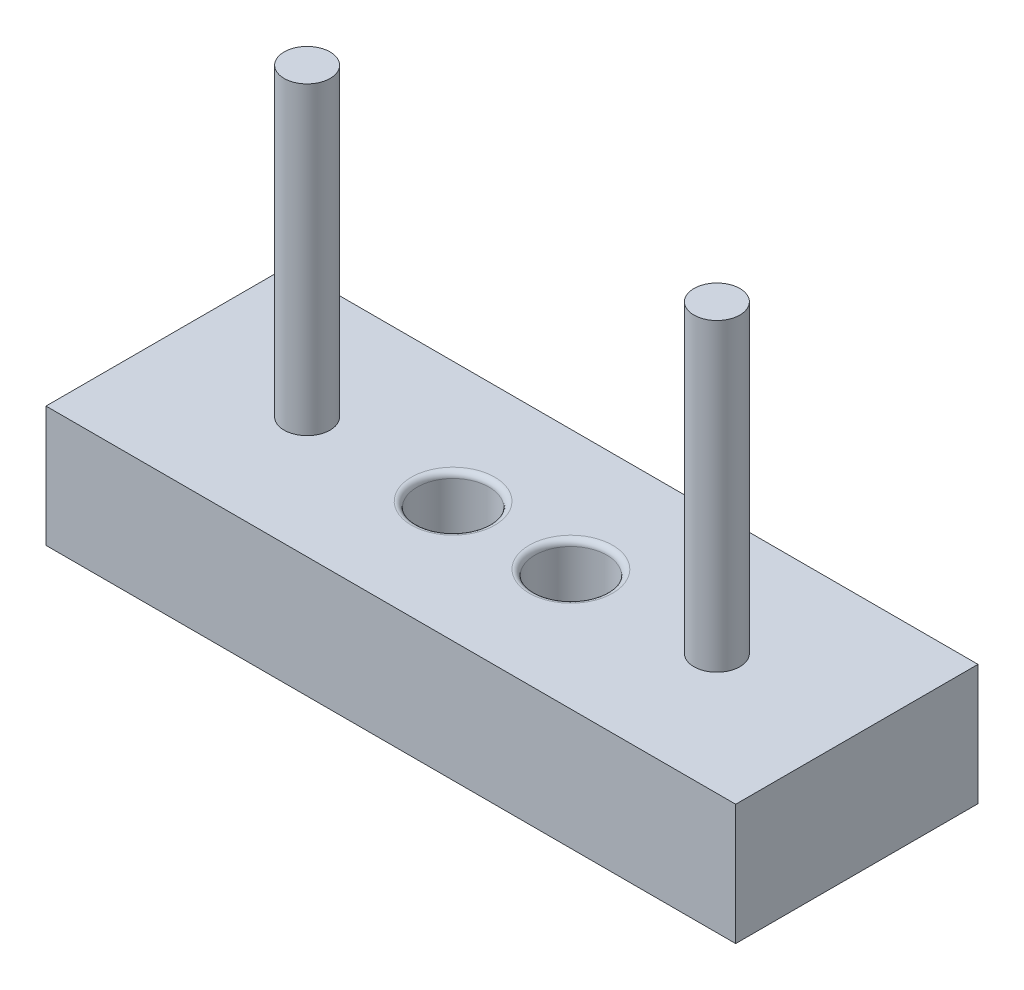
ISO-10303-21;
HEADER;
FILE_DESCRIPTION(('STEP AP214'),'2;1');
FILE_NAME('part.step','',(''),(''),'','','');
FILE_SCHEMA(('AUTOMOTIVE_DESIGN { 1 0 10303 214 1 1 1 1 }'));
ENDSEC;
DATA;
#1=APPLICATION_CONTEXT('core data for automotive mechanical design processes');
#2=APPLICATION_PROTOCOL_DEFINITION('international standard','automotive_design',2000,#1);
#3=PRODUCT_CONTEXT('',#1,'mechanical');
#4=PRODUCT('Part','Part','',(#3));
#5=PRODUCT_RELATED_PRODUCT_CATEGORY('part','',(#4));
#6=PRODUCT_DEFINITION_FORMATION('','',#4);
#7=PRODUCT_DEFINITION_CONTEXT('part definition',#1,'design');
#8=PRODUCT_DEFINITION('design','',#6,#7);
#9=PRODUCT_DEFINITION_SHAPE('','',#8);
#10=(LENGTH_UNIT() NAMED_UNIT(*) SI_UNIT(.MILLI.,.METRE.));
#11=(NAMED_UNIT(*) PLANE_ANGLE_UNIT() SI_UNIT($,.RADIAN.));
#12=(NAMED_UNIT(*) SI_UNIT($,.STERADIAN.) SOLID_ANGLE_UNIT());
#13=UNCERTAINTY_MEASURE_WITH_UNIT(LENGTH_MEASURE(1.E-05),#10,'distance_accuracy_value','');
#14=(GEOMETRIC_REPRESENTATION_CONTEXT(3) GLOBAL_UNCERTAINTY_ASSIGNED_CONTEXT((#13)) GLOBAL_UNIT_ASSIGNED_CONTEXT((#10,
#11,#12)) REPRESENTATION_CONTEXT('',''));
#15=CARTESIAN_POINT('',(0.,0.,0.));
#16=DIRECTION('',(0.,0.,1.));
#17=DIRECTION('',(1.,0.,0.));
#18=AXIS2_PLACEMENT_3D('',#15,#16,#17);
#19=CARTESIAN_POINT('',(-43.188970763014,21.,-20.565514618493));
#20=DIRECTION('',(1.,0.,0.));
#21=DIRECTION('',(0.,0.,-1.));
#22=AXIS2_PLACEMENT_3D('',#19,#20,#21);
#23=PLANE('',#22);
#24=DIRECTION('',(0.,0.,1.));
#25=VECTOR('',#24,1.);
#26=CARTESIAN_POINT('',(-43.188970763014,0.,-20.565514618493));
#27=LINE('',#26,#25);
#28=CARTESIAN_POINT('',(-43.188970763014,0.,-20.565514618493));
#29=VERTEX_POINT('',#28);
#30=CARTESIAN_POINT('',(-43.188970763014,0.,21.594485381507));
#31=VERTEX_POINT('',#30);
#32=EDGE_CURVE('E106',#29,#31,#27,.T.);
#33=ORIENTED_EDGE('',*,*,#32,.T.);
#34=DIRECTION('',(0.,-1.,0.));
#35=VECTOR('',#34,1.);
#36=CARTESIAN_POINT('',(-43.188970763014,21.,21.594485381507));
#37=LINE('',#36,#35);
#38=CARTESIAN_POINT('',(-43.188970763014,21.,21.594485381507));
#39=VERTEX_POINT('',#38);
#40=EDGE_CURVE('E97',#39,#31,#37,.T.);
#41=ORIENTED_EDGE('',*,*,#40,.F.);
#42=DIRECTION('',(0.,0.,1.));
#43=VECTOR('',#42,1.);
#44=CARTESIAN_POINT('',(-43.188970763014,21.,-20.565514618493));
#45=LINE('',#44,#43);
#46=CARTESIAN_POINT('',(-43.188970763014,21.,-20.565514618493));
#47=VERTEX_POINT('',#46);
#48=EDGE_CURVE('E91',#47,#39,#45,.T.);
#49=ORIENTED_EDGE('',*,*,#48,.F.);
#50=DIRECTION('',(0.,-1.,0.));
#51=VECTOR('',#50,1.);
#52=CARTESIAN_POINT('',(-43.188970763014,21.,-20.565514618493));
#53=LINE('',#52,#51);
#54=EDGE_CURVE('E102',#47,#29,#53,.T.);
#55=ORIENTED_EDGE('',*,*,#54,.T.);
#56=EDGE_LOOP('',(#33,#41,#49,#55));
#57=FACE_BOUND('',#56,.T.);
#58=ADVANCED_FACE('F38',(#57),#23,.F.);
#59=CARTESIAN_POINT('',(-43.188970763014,21.,21.594485381507));
#60=DIRECTION('',(0.,0.,-1.));
#61=DIRECTION('',(-1.,0.,0.));
#62=AXIS2_PLACEMENT_3D('',#59,#60,#61);
#63=PLANE('',#62);
#64=DIRECTION('',(1.,0.,0.));
#65=VECTOR('',#64,1.);
#66=CARTESIAN_POINT('',(-43.188970763014,0.,21.594485381507));
#67=LINE('',#66,#65);
#68=CARTESIAN_POINT('',(76.811029236986,0.,21.594485381507));
#69=VERTEX_POINT('',#68);
#70=EDGE_CURVE('E96',#31,#69,#67,.T.);
#71=ORIENTED_EDGE('',*,*,#70,.T.);
#72=DIRECTION('',(0.,-1.,0.));
#73=VECTOR('',#72,1.);
#74=CARTESIAN_POINT('',(76.811029236986,21.,21.594485381507));
#75=LINE('',#74,#73);
#76=CARTESIAN_POINT('',(76.811029236986,21.,21.594485381507));
#77=VERTEX_POINT('',#76);
#78=EDGE_CURVE('E94',#77,#69,#75,.T.);
#79=ORIENTED_EDGE('',*,*,#78,.F.);
#80=DIRECTION('',(1.,0.,0.));
#81=VECTOR('',#80,1.);
#82=CARTESIAN_POINT('',(-43.188970763014,21.,21.594485381507));
#83=LINE('',#82,#81);
#84=EDGE_CURVE('E86',#39,#77,#83,.T.);
#85=ORIENTED_EDGE('',*,*,#84,.F.);
#86=ORIENTED_EDGE('',*,*,#40,.T.);
#87=EDGE_LOOP('',(#71,#79,#85,#86));
#88=FACE_BOUND('',#87,.T.);
#89=ADVANCED_FACE('F95',(#88),#63,.F.);
#90=CARTESIAN_POINT('',(76.811029236986,21.,-20.565514618493));
#91=DIRECTION('',(-1.,0.,0.));
#92=DIRECTION('',(0.,0.,1.));
#93=AXIS2_PLACEMENT_3D('',#90,#91,#92);
#94=PLANE('',#93);
#95=DIRECTION('',(0.,0.,-1.));
#96=VECTOR('',#95,1.);
#97=CARTESIAN_POINT('',(76.811029236986,0.,-20.565514618493));
#98=LINE('',#97,#96);
#99=CARTESIAN_POINT('',(76.811029236986,0.,-20.565514618493));
#100=VERTEX_POINT('',#99);
#101=EDGE_CURVE('E72',#69,#100,#98,.T.);
#102=ORIENTED_EDGE('',*,*,#101,.T.);
#103=DIRECTION('',(0.,-1.,0.));
#104=VECTOR('',#103,1.);
#105=CARTESIAN_POINT('',(76.811029236986,21.,-20.565514618493));
#106=LINE('',#105,#104);
#107=CARTESIAN_POINT('',(76.811029236986,21.,-20.565514618493));
#108=VERTEX_POINT('',#107);
#109=EDGE_CURVE('E98',#108,#100,#106,.T.);
#110=ORIENTED_EDGE('',*,*,#109,.F.);
#111=DIRECTION('',(0.,0.,-1.));
#112=VECTOR('',#111,1.);
#113=CARTESIAN_POINT('',(76.811029236986,21.,-20.565514618493));
#114=LINE('',#113,#112);
#115=EDGE_CURVE('E89',#77,#108,#114,.T.);
#116=ORIENTED_EDGE('',*,*,#115,.F.);
#117=ORIENTED_EDGE('',*,*,#78,.T.);
#118=EDGE_LOOP('',(#102,#110,#116,#117));
#119=FACE_BOUND('',#118,.T.);
#120=ADVANCED_FACE('F100',(#119),#94,.F.);
#121=CARTESIAN_POINT('',(-43.188970763014,21.,-20.565514618493));
#122=DIRECTION('',(0.,0.,1.));
#123=DIRECTION('',(1.,0.,0.));
#124=AXIS2_PLACEMENT_3D('',#121,#122,#123);
#125=PLANE('',#124);
#126=DIRECTION('',(-1.,0.,0.));
#127=VECTOR('',#126,1.);
#128=CARTESIAN_POINT('',(-43.188970763014,0.,-20.565514618493));
#129=LINE('',#128,#127);
#130=EDGE_CURVE('E78',#100,#29,#129,.T.);
#131=ORIENTED_EDGE('',*,*,#130,.T.);
#132=ORIENTED_EDGE('',*,*,#54,.F.);
#133=DIRECTION('',(-1.,0.,0.));
#134=VECTOR('',#133,1.);
#135=CARTESIAN_POINT('',(-43.188970763014,21.,-20.565514618493));
#136=LINE('',#135,#134);
#137=EDGE_CURVE('E55',#108,#47,#136,.T.);
#138=ORIENTED_EDGE('',*,*,#137,.F.);
#139=ORIENTED_EDGE('',*,*,#109,.T.);
#140=EDGE_LOOP('',(#131,#132,#138,#139));
#141=FACE_BOUND('',#140,.T.);
#142=ADVANCED_FACE('F154',(#141),#125,.F.);
#143=CARTESIAN_POINT('',(0.,21.,0.));
#144=DIRECTION('',(0.,1.,0.));
#145=DIRECTION('',(0.,0.,1.));
#146=AXIS2_PLACEMENT_3D('',#143,#144,#145);
#147=PLANE('',#146);
#148=CARTESIAN_POINT('',(-18.838970763014,21.,0.514485381507019));
#149=DIRECTION('',(0.,1.,0.));
#150=DIRECTION('',(0.,0.,1.));
#151=AXIS2_PLACEMENT_3D('',#148,#149,#150);
#152=CIRCLE('',#151,4.);
#153=CARTESIAN_POINT('',(-18.838970763014,21.,4.51448538150702));
#154=VERTEX_POINT('',#153);
#155=EDGE_CURVE('E208',#154,#154,#152,.T.);
#156=ORIENTED_EDGE('',*,*,#155,.F.);
#157=EDGE_LOOP('',(#156));
#158=FACE_BOUND('',#157,.T.);
#159=CARTESIAN_POINT('',(52.461029236986,21.,0.514485381507019));
#160=DIRECTION('',(0.,1.,0.));
#161=DIRECTION('',(0.,0.,1.));
#162=AXIS2_PLACEMENT_3D('',#159,#160,#161);
#163=CIRCLE('',#162,4.00000000000001);
#164=CARTESIAN_POINT('',(52.461029236986,21.,4.51448538150702));
#165=VERTEX_POINT('',#164);
#166=EDGE_CURVE('E202',#165,#165,#163,.T.);
#167=ORIENTED_EDGE('',*,*,#166,.F.);
#168=EDGE_LOOP('',(#167));
#169=FACE_BOUND('',#168,.T.);
#170=CARTESIAN_POINT('',(6.56102923698599,21.,0.514485381507019));
#171=DIRECTION('',(0.,1.,0.));
#172=DIRECTION('',(0.,0.,1.));
#173=AXIS2_PLACEMENT_3D('',#170,#171,#172);
#174=CIRCLE('',#173,7.25);
#175=CARTESIAN_POINT('',(6.56102923698599,21.,7.76448538150702));
#176=VERTEX_POINT('',#175);
#177=EDGE_CURVE('E122',#176,#176,#174,.F.);
#178=ORIENTED_EDGE('',*,*,#177,.T.);
#179=EDGE_LOOP('',(#178));
#180=FACE_BOUND('',#179,.T.);
#181=CARTESIAN_POINT('',(27.061029236986,21.,0.514485381507019));
#182=DIRECTION('',(0.,1.,0.));
#183=DIRECTION('',(0.,0.,1.));
#184=AXIS2_PLACEMENT_3D('',#181,#182,#183);
#185=CIRCLE('',#184,7.25);
#186=CARTESIAN_POINT('',(27.061029236986,21.,7.76448538150702));
#187=VERTEX_POINT('',#186);
#188=EDGE_CURVE('E119',#187,#187,#185,.F.);
#189=ORIENTED_EDGE('',*,*,#188,.T.);
#190=EDGE_LOOP('',(#189));
#191=FACE_BOUND('',#190,.T.);
#192=ORIENTED_EDGE('',*,*,#48,.T.);
#193=ORIENTED_EDGE('',*,*,#84,.T.);
#194=ORIENTED_EDGE('',*,*,#115,.T.);
#195=ORIENTED_EDGE('',*,*,#137,.T.);
#196=EDGE_LOOP('',(#192,#193,#194,#195));
#197=FACE_BOUND('',#196,.T.);
#198=ADVANCED_FACE('F87',(#158,#169,#180,#191,#197),#147,.T.);
#199=CARTESIAN_POINT('',(0.,0.,0.));
#200=DIRECTION('',(0.,1.,0.));
#201=DIRECTION('',(0.,0.,1.));
#202=AXIS2_PLACEMENT_3D('',#199,#200,#201);
#203=PLANE('',#202);
#204=CARTESIAN_POINT('',(6.56102923698599,0.,0.514485381507019));
#205=DIRECTION('',(0.,1.,0.));
#206=DIRECTION('',(0.,0.,1.));
#207=AXIS2_PLACEMENT_3D('',#204,#205,#206);
#208=CIRCLE('',#207,3.75);
#209=CARTESIAN_POINT('',(6.56102923698599,0.,4.26448538150702));
#210=VERTEX_POINT('',#209);
#211=EDGE_CURVE('E131',#210,#210,#208,.T.);
#212=ORIENTED_EDGE('',*,*,#211,.T.);
#213=EDGE_LOOP('',(#212));
#214=FACE_BOUND('',#213,.T.);
#215=CARTESIAN_POINT('',(27.061029236986,0.,0.514485381507019));
#216=DIRECTION('',(0.,1.,0.));
#217=DIRECTION('',(0.,0.,1.));
#218=AXIS2_PLACEMENT_3D('',#215,#216,#217);
#219=CIRCLE('',#218,3.75);
#220=CARTESIAN_POINT('',(27.061029236986,0.,4.26448538150702));
#221=VERTEX_POINT('',#220);
#222=EDGE_CURVE('E128',#221,#221,#219,.T.);
#223=ORIENTED_EDGE('',*,*,#222,.T.);
#224=EDGE_LOOP('',(#223));
#225=FACE_BOUND('',#224,.T.);
#226=ORIENTED_EDGE('',*,*,#32,.F.);
#227=ORIENTED_EDGE('',*,*,#130,.F.);
#228=ORIENTED_EDGE('',*,*,#101,.F.);
#229=ORIENTED_EDGE('',*,*,#70,.F.);
#230=EDGE_LOOP('',(#226,#227,#228,#229));
#231=FACE_BOUND('',#230,.T.);
#232=ADVANCED_FACE('F145',(#214,#225,#231),#203,.F.);
#233=CARTESIAN_POINT('',(27.061029236986,7.,0.514485381507019));
#234=DIRECTION('',(0.,1.,0.));
#235=DIRECTION('',(0.,0.,1.));
#236=AXIS2_PLACEMENT_3D('',#233,#234,#235);
#237=CYLINDRICAL_SURFACE('',#236,6.25);
#238=CARTESIAN_POINT('',(27.061029236986,20.,0.514485381507019));
#239=DIRECTION('',(0.,1.,0.));
#240=DIRECTION('',(0.,0.,1.));
#241=AXIS2_PLACEMENT_3D('',#238,#239,#240);
#242=CIRCLE('',#241,6.25);
#243=CARTESIAN_POINT('',(27.061029236986,20.,6.76448538150702));
#244=VERTEX_POINT('',#243);
#245=EDGE_CURVE('E125',#244,#244,#242,.T.);
#246=ORIENTED_EDGE('',*,*,#245,.T.);
#247=EDGE_LOOP('',(#246));
#248=FACE_BOUND('',#247,.T.);
#249=CARTESIAN_POINT('',(27.061029236986,7.,0.514485381507019));
#250=DIRECTION('',(0.,1.,0.));
#251=DIRECTION('',(0.,0.,1.));
#252=AXIS2_PLACEMENT_3D('',#249,#250,#251);
#253=CIRCLE('',#252,6.25);
#254=CARTESIAN_POINT('',(27.061029236986,7.,6.76448538150702));
#255=VERTEX_POINT('',#254);
#256=EDGE_CURVE('E109',#255,#255,#253,.T.);
#257=ORIENTED_EDGE('',*,*,#256,.F.);
#258=EDGE_LOOP('',(#257));
#259=FACE_BOUND('',#258,.T.);
#260=ADVANCED_FACE('F148',(#248,#259),#237,.F.);
#261=CARTESIAN_POINT('',(0.,7.,0.));
#262=DIRECTION('',(0.,1.,0.));
#263=DIRECTION('',(0.,0.,1.));
#264=AXIS2_PLACEMENT_3D('',#261,#262,#263);
#265=PLANE('',#264);
#266=CARTESIAN_POINT('',(27.061029236986,7.,0.514485381507019));
#267=DIRECTION('',(0.,1.,0.));
#268=DIRECTION('',(0.,0.,1.));
#269=AXIS2_PLACEMENT_3D('',#266,#267,#268);
#270=CIRCLE('',#269,3.25);
#271=CARTESIAN_POINT('',(27.061029236986,7.,3.76448538150702));
#272=VERTEX_POINT('',#271);
#273=EDGE_CURVE('E193',#272,#272,#270,.T.);
#274=ORIENTED_EDGE('',*,*,#273,.F.);
#275=EDGE_LOOP('',(#274));
#276=FACE_BOUND('',#275,.T.);
#277=ORIENTED_EDGE('',*,*,#256,.T.);
#278=EDGE_LOOP('',(#277));
#279=FACE_BOUND('',#278,.T.);
#280=ADVANCED_FACE('F185',(#276,#279),#265,.T.);
#281=CARTESIAN_POINT('',(6.56102923698599,7.,0.514485381507019));
#282=DIRECTION('',(0.,1.,0.));
#283=DIRECTION('',(0.,0.,1.));
#284=AXIS2_PLACEMENT_3D('',#281,#282,#283);
#285=CYLINDRICAL_SURFACE('',#284,6.25);
#286=CARTESIAN_POINT('',(6.56102923698599,20.,0.514485381507019));
#287=DIRECTION('',(0.,1.,0.));
#288=DIRECTION('',(0.,0.,1.));
#289=AXIS2_PLACEMENT_3D('',#286,#287,#288);
#290=CIRCLE('',#289,6.25);
#291=CARTESIAN_POINT('',(6.56102923698599,20.,6.76448538150702));
#292=VERTEX_POINT('',#291);
#293=EDGE_CURVE('E116',#292,#292,#290,.T.);
#294=ORIENTED_EDGE('',*,*,#293,.T.);
#295=EDGE_LOOP('',(#294));
#296=FACE_BOUND('',#295,.T.);
#297=CARTESIAN_POINT('',(6.56102923698599,7.,0.514485381507019));
#298=DIRECTION('',(0.,1.,0.));
#299=DIRECTION('',(0.,0.,1.));
#300=AXIS2_PLACEMENT_3D('',#297,#298,#299);
#301=CIRCLE('',#300,6.25);
#302=CARTESIAN_POINT('',(6.56102923698599,7.,6.76448538150702));
#303=VERTEX_POINT('',#302);
#304=EDGE_CURVE('E190',#303,#303,#301,.T.);
#305=ORIENTED_EDGE('',*,*,#304,.F.);
#306=EDGE_LOOP('',(#305));
#307=FACE_BOUND('',#306,.T.);
#308=ADVANCED_FACE('F230',(#296,#307),#285,.F.);
#309=CARTESIAN_POINT('',(0.,7.,0.));
#310=DIRECTION('',(0.,1.,0.));
#311=DIRECTION('',(0.,0.,1.));
#312=AXIS2_PLACEMENT_3D('',#309,#310,#311);
#313=PLANE('',#312);
#314=CARTESIAN_POINT('',(6.56102923698599,7.,0.514485381507019));
#315=DIRECTION('',(0.,1.,0.));
#316=DIRECTION('',(0.,0.,1.));
#317=AXIS2_PLACEMENT_3D('',#314,#315,#316);
#318=CIRCLE('',#317,3.25);
#319=CARTESIAN_POINT('',(6.56102923698599,7.,3.76448538150702));
#320=VERTEX_POINT('',#319);
#321=EDGE_CURVE('E198',#320,#320,#318,.T.);
#322=ORIENTED_EDGE('',*,*,#321,.F.);
#323=EDGE_LOOP('',(#322));
#324=FACE_BOUND('',#323,.T.);
#325=ORIENTED_EDGE('',*,*,#304,.T.);
#326=EDGE_LOOP('',(#325));
#327=FACE_BOUND('',#326,.T.);
#328=ADVANCED_FACE('F233',(#324,#327),#313,.T.);
#329=CARTESIAN_POINT('',(27.061029236986,0.,0.514485381507019));
#330=DIRECTION('',(0.,1.,0.));
#331=DIRECTION('',(0.,0.,1.));
#332=AXIS2_PLACEMENT_3D('',#329,#330,#331);
#333=CYLINDRICAL_SURFACE('',#332,3.25);
#334=CARTESIAN_POINT('',(27.061029236986,0.5,0.514485381507019));
#335=DIRECTION('',(0.,1.,0.));
#336=DIRECTION('',(0.,0.,1.));
#337=AXIS2_PLACEMENT_3D('',#334,#335,#336);
#338=CIRCLE('',#337,3.25);
#339=CARTESIAN_POINT('',(27.061029236986,0.5,3.76448538150702));
#340=VERTEX_POINT('',#339);
#341=EDGE_CURVE('E11',#340,#340,#338,.F.);
#342=ORIENTED_EDGE('',*,*,#341,.T.);
#343=EDGE_LOOP('',(#342));
#344=FACE_BOUND('',#343,.T.);
#345=ORIENTED_EDGE('',*,*,#273,.T.);
#346=EDGE_LOOP('',(#345));
#347=FACE_BOUND('',#346,.T.);
#348=ADVANCED_FACE('F238',(#344,#347),#333,.F.);
#349=CARTESIAN_POINT('',(6.56102923698599,0.,0.514485381507019));
#350=DIRECTION('',(0.,1.,0.));
#351=DIRECTION('',(0.,0.,1.));
#352=AXIS2_PLACEMENT_3D('',#349,#350,#351);
#353=CYLINDRICAL_SURFACE('',#352,3.25);
#354=CARTESIAN_POINT('',(6.56102923698599,0.5,0.514485381507019));
#355=DIRECTION('',(0.,1.,0.));
#356=DIRECTION('',(0.,0.,1.));
#357=AXIS2_PLACEMENT_3D('',#354,#355,#356);
#358=CIRCLE('',#357,3.25);
#359=CARTESIAN_POINT('',(6.56102923698599,0.5,3.76448538150702));
#360=VERTEX_POINT('',#359);
#361=EDGE_CURVE('E47',#360,#360,#358,.F.);
#362=ORIENTED_EDGE('',*,*,#361,.T.);
#363=EDGE_LOOP('',(#362));
#364=FACE_BOUND('',#363,.T.);
#365=ORIENTED_EDGE('',*,*,#321,.T.);
#366=EDGE_LOOP('',(#365));
#367=FACE_BOUND('',#366,.T.);
#368=ADVANCED_FACE('F136',(#364,#367),#353,.F.);
#369=CARTESIAN_POINT('',(6.56102923698599,20.,0.514485381507019));
#370=DIRECTION('',(0.,1.,0.));
#371=DIRECTION('',(0.,0.,1.));
#372=AXIS2_PLACEMENT_3D('',#369,#370,#371);
#373=TOROIDAL_SURFACE('',#372,7.25,1.);
#374=ORIENTED_EDGE('',*,*,#177,.F.);
#375=EDGE_LOOP('',(#374));
#376=FACE_BOUND('',#375,.T.);
#377=ORIENTED_EDGE('',*,*,#293,.F.);
#378=EDGE_LOOP('',(#377));
#379=FACE_BOUND('',#378,.T.);
#380=ADVANCED_FACE('F171',(#376,#379),#373,.T.);
#381=CARTESIAN_POINT('',(27.061029236986,20.,0.514485381507019));
#382=DIRECTION('',(0.,1.,0.));
#383=DIRECTION('',(0.,0.,1.));
#384=AXIS2_PLACEMENT_3D('',#381,#382,#383);
#385=TOROIDAL_SURFACE('',#384,7.25,1.);
#386=ORIENTED_EDGE('',*,*,#188,.F.);
#387=EDGE_LOOP('',(#386));
#388=FACE_BOUND('',#387,.T.);
#389=ORIENTED_EDGE('',*,*,#245,.F.);
#390=EDGE_LOOP('',(#389));
#391=FACE_BOUND('',#390,.T.);
#392=ADVANCED_FACE('F142',(#388,#391),#385,.T.);
#393=CARTESIAN_POINT('',(6.56102923698599,0.5,0.514485381507019));
#394=DIRECTION('',(0.,1.,0.));
#395=DIRECTION('',(0.,0.,1.));
#396=AXIS2_PLACEMENT_3D('',#393,#394,#395);
#397=TOROIDAL_SURFACE('',#396,3.75,0.5);
#398=ORIENTED_EDGE('',*,*,#361,.F.);
#399=EDGE_LOOP('',(#398));
#400=FACE_BOUND('',#399,.T.);
#401=ORIENTED_EDGE('',*,*,#211,.F.);
#402=EDGE_LOOP('',(#401));
#403=FACE_BOUND('',#402,.T.);
#404=ADVANCED_FACE('F139',(#400,#403),#397,.T.);
#405=CARTESIAN_POINT('',(27.061029236986,0.5,0.514485381507019));
#406=DIRECTION('',(0.,1.,0.));
#407=DIRECTION('',(0.,0.,1.));
#408=AXIS2_PLACEMENT_3D('',#405,#406,#407);
#409=TOROIDAL_SURFACE('',#408,3.75,0.5);
#410=ORIENTED_EDGE('',*,*,#341,.F.);
#411=EDGE_LOOP('',(#410));
#412=FACE_BOUND('',#411,.T.);
#413=ORIENTED_EDGE('',*,*,#222,.F.);
#414=EDGE_LOOP('',(#413));
#415=FACE_BOUND('',#414,.T.);
#416=ADVANCED_FACE('F40',(#412,#415),#409,.T.);
#417=CARTESIAN_POINT('',(52.461029236986,74.,0.514485381507019));
#418=DIRECTION('',(0.,-1.,0.));
#419=DIRECTION('',(0.,0.,-1.));
#420=AXIS2_PLACEMENT_3D('',#417,#418,#419);
#421=CYLINDRICAL_SURFACE('',#420,4.00000000000001);
#422=CARTESIAN_POINT('',(52.461029236986,74.,0.514485381507019));
#423=DIRECTION('',(0.,1.,0.));
#424=DIRECTION('',(0.,0.,1.));
#425=AXIS2_PLACEMENT_3D('',#422,#423,#424);
#426=CIRCLE('',#425,4.00000000000001);
#427=CARTESIAN_POINT('',(52.461029236986,74.,4.51448538150702));
#428=VERTEX_POINT('',#427);
#429=EDGE_CURVE('E201',#428,#428,#426,.T.);
#430=ORIENTED_EDGE('',*,*,#429,.F.);
#431=EDGE_LOOP('',(#430));
#432=FACE_BOUND('',#431,.T.);
#433=ORIENTED_EDGE('',*,*,#166,.T.);
#434=EDGE_LOOP('',(#433));
#435=FACE_BOUND('',#434,.T.);
#436=ADVANCED_FACE('F310',(#432,#435),#421,.T.);
#437=CARTESIAN_POINT('',(0.,74.,0.));
#438=DIRECTION('',(0.,1.,0.));
#439=DIRECTION('',(0.,0.,1.));
#440=AXIS2_PLACEMENT_3D('',#437,#438,#439);
#441=PLANE('',#440);
#442=ORIENTED_EDGE('',*,*,#429,.T.);
#443=EDGE_LOOP('',(#442));
#444=FACE_BOUND('',#443,.T.);
#445=ADVANCED_FACE('F219',(#444),#441,.T.);
#446=CARTESIAN_POINT('',(-18.838970763014,74.,0.514485381507019));
#447=DIRECTION('',(0.,-1.,0.));
#448=DIRECTION('',(0.,0.,-1.));
#449=AXIS2_PLACEMENT_3D('',#446,#447,#448);
#450=CYLINDRICAL_SURFACE('',#449,4.);
#451=CARTESIAN_POINT('',(-18.838970763014,74.,0.514485381507019));
#452=DIRECTION('',(0.,1.,0.));
#453=DIRECTION('',(0.,0.,1.));
#454=AXIS2_PLACEMENT_3D('',#451,#452,#453);
#455=CIRCLE('',#454,4.);
#456=CARTESIAN_POINT('',(-18.838970763014,74.,4.51448538150702));
#457=VERTEX_POINT('',#456);
#458=EDGE_CURVE('E205',#457,#457,#455,.T.);
#459=ORIENTED_EDGE('',*,*,#458,.F.);
#460=EDGE_LOOP('',(#459));
#461=FACE_BOUND('',#460,.T.);
#462=ORIENTED_EDGE('',*,*,#155,.T.);
#463=EDGE_LOOP('',(#462));
#464=FACE_BOUND('',#463,.T.);
#465=ADVANCED_FACE('F216',(#461,#464),#450,.T.);
#466=CARTESIAN_POINT('',(0.,74.,0.));
#467=DIRECTION('',(0.,1.,0.));
#468=DIRECTION('',(0.,0.,1.));
#469=AXIS2_PLACEMENT_3D('',#466,#467,#468);
#470=PLANE('',#469);
#471=ORIENTED_EDGE('',*,*,#458,.T.);
#472=EDGE_LOOP('',(#471));
#473=FACE_BOUND('',#472,.T.);
#474=ADVANCED_FACE('F214',(#473),#470,.T.);
#475=CLOSED_SHELL('',(#58,#89,#120,#142,#198,#232,#260,#280,#308,#328,#348,#368,#380,#392,#404,
#416,#436,#445,#465,#474));
#476=MANIFOLD_SOLID_BREP('B2',#475);
#477=ADVANCED_BREP_SHAPE_REPRESENTATION('',(#18,#476),#14);
#478=SHAPE_DEFINITION_REPRESENTATION(#9,#477);
ENDSEC;
END-ISO-10303-21;
